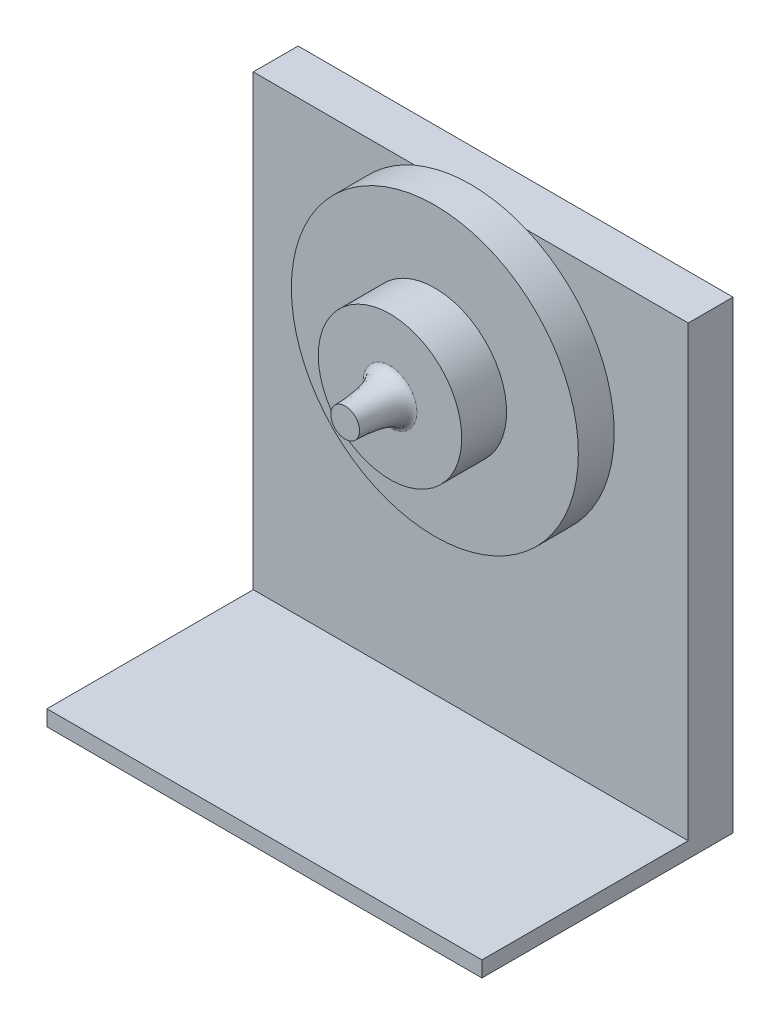
ISO-10303-21;
HEADER;
FILE_DESCRIPTION(('STEP AP214'),'2;1');
FILE_NAME('part.step','',(''),(''),'','','');
FILE_SCHEMA(('AUTOMOTIVE_DESIGN { 1 0 10303 214 1 1 1 1 }'));
ENDSEC;
DATA;
#1=APPLICATION_CONTEXT('core data for automotive mechanical design processes');
#2=APPLICATION_PROTOCOL_DEFINITION('international standard','automotive_design',2000,#1);
#3=PRODUCT_CONTEXT('',#1,'mechanical');
#4=PRODUCT('Part','Part','',(#3));
#5=PRODUCT_RELATED_PRODUCT_CATEGORY('part','',(#4));
#6=PRODUCT_DEFINITION_FORMATION('','',#4);
#7=PRODUCT_DEFINITION_CONTEXT('part definition',#1,'design');
#8=PRODUCT_DEFINITION('design','',#6,#7);
#9=PRODUCT_DEFINITION_SHAPE('','',#8);
#10=(LENGTH_UNIT() NAMED_UNIT(*) SI_UNIT(.MILLI.,.METRE.));
#11=(NAMED_UNIT(*) PLANE_ANGLE_UNIT() SI_UNIT($,.RADIAN.));
#12=(NAMED_UNIT(*) SI_UNIT($,.STERADIAN.) SOLID_ANGLE_UNIT());
#13=UNCERTAINTY_MEASURE_WITH_UNIT(LENGTH_MEASURE(1.E-05),#10,'distance_accuracy_value','');
#14=(GEOMETRIC_REPRESENTATION_CONTEXT(3) GLOBAL_UNCERTAINTY_ASSIGNED_CONTEXT((#13)) GLOBAL_UNIT_ASSIGNED_CONTEXT((#10,
#11,#12)) REPRESENTATION_CONTEXT('',''));
#15=CARTESIAN_POINT('',(0.,0.,0.));
#16=DIRECTION('',(0.,0.,1.));
#17=DIRECTION('',(1.,0.,0.));
#18=AXIS2_PLACEMENT_3D('',#15,#16,#17);
#19=CARTESIAN_POINT('',(-242.5,1.21076133831073E-13,-50.));
#20=DIRECTION('',(-1.,0.,0.));
#21=DIRECTION('',(0.,0.,1.));
#22=AXIS2_PLACEMENT_3D('',#19,#20,#21);
#23=PLANE('',#22);
#24=DIRECTION('',(0.,-1.,0.));
#25=VECTOR('',#24,1.);
#26=CARTESIAN_POINT('',(-242.5,1.21076133831073E-13,0.));
#27=LINE('',#26,#25);
#28=CARTESIAN_POINT('',(-242.5,500.,0.));
#29=VERTEX_POINT('',#28);
#30=CARTESIAN_POINT('',(-242.5,0.,0.));
#31=VERTEX_POINT('',#30);
#32=EDGE_CURVE('E77',#29,#31,#27,.T.);
#33=ORIENTED_EDGE('',*,*,#32,.F.);
#34=DIRECTION('',(0.,0.,1.));
#35=VECTOR('',#34,1.);
#36=CARTESIAN_POINT('',(-242.5,500.,-50.));
#37=LINE('',#36,#35);
#38=CARTESIAN_POINT('',(-242.5,500.,-50.));
#39=VERTEX_POINT('',#38);
#40=EDGE_CURVE('E47',#39,#29,#37,.T.);
#41=ORIENTED_EDGE('',*,*,#40,.F.);
#42=DIRECTION('',(0.,-1.,0.));
#43=VECTOR('',#42,1.);
#44=CARTESIAN_POINT('',(-242.5,1.21076133831073E-13,-50.));
#45=LINE('',#44,#43);
#46=CARTESIAN_POINT('',(-242.5,-17.5,-50.));
#47=VERTEX_POINT('',#46);
#48=EDGE_CURVE('E114',#39,#47,#45,.T.);
#49=ORIENTED_EDGE('',*,*,#48,.T.);
#50=DIRECTION('',(0.,0.,1.));
#51=VECTOR('',#50,1.);
#52=CARTESIAN_POINT('',(-242.5,-17.5,-50.));
#53=LINE('',#52,#51);
#54=CARTESIAN_POINT('',(-242.5,-17.5,230.));
#55=VERTEX_POINT('',#54);
#56=EDGE_CURVE('E133',#47,#55,#53,.T.);
#57=ORIENTED_EDGE('',*,*,#56,.T.);
#58=DIRECTION('',(0.,1.,0.));
#59=VECTOR('',#58,1.);
#60=CARTESIAN_POINT('',(-242.5,-17.5,230.));
#61=LINE('',#60,#59);
#62=CARTESIAN_POINT('',(-242.5,0.,230.));
#63=VERTEX_POINT('',#62);
#64=EDGE_CURVE('E106',#55,#63,#61,.T.);
#65=ORIENTED_EDGE('',*,*,#64,.T.);
#66=DIRECTION('',(0.,0.,1.));
#67=VECTOR('',#66,1.);
#68=CARTESIAN_POINT('',(-242.5,0.,-50.));
#69=LINE('',#68,#67);
#70=EDGE_CURVE('E97',#31,#63,#69,.T.);
#71=ORIENTED_EDGE('',*,*,#70,.F.);
#72=EDGE_LOOP('',(#33,#41,#49,#57,#65,#71));
#73=FACE_BOUND('',#72,.T.);
#74=ADVANCED_FACE('F39',(#73),#23,.T.);
#75=CARTESIAN_POINT('',(-242.5,500.,-50.));
#76=DIRECTION('',(0.,1.,0.));
#77=DIRECTION('',(-1.,0.,0.));
#78=AXIS2_PLACEMENT_3D('',#75,#76,#77);
#79=PLANE('',#78);
#80=DIRECTION('',(-1.,0.,0.));
#81=VECTOR('',#80,1.);
#82=CARTESIAN_POINT('',(-242.5,500.,0.));
#83=LINE('',#82,#81);
#84=CARTESIAN_POINT('',(242.5,500.,0.));
#85=VERTEX_POINT('',#84);
#86=CARTESIAN_POINT('',(62.2353597241954,500.,0.));
#87=VERTEX_POINT('',#86);
#88=EDGE_CURVE('E85',#85,#87,#83,.T.);
#89=ORIENTED_EDGE('',*,*,#88,.F.);
#90=DIRECTION('',(0.,0.,1.));
#91=VECTOR('',#90,1.);
#92=CARTESIAN_POINT('',(242.5,500.,-50.));
#93=LINE('',#92,#91);
#94=CARTESIAN_POINT('',(242.5,500.,-50.));
#95=VERTEX_POINT('',#94);
#96=EDGE_CURVE('E92',#95,#85,#93,.T.);
#97=ORIENTED_EDGE('',*,*,#96,.F.);
#98=DIRECTION('',(-1.,0.,0.));
#99=VECTOR('',#98,1.);
#100=CARTESIAN_POINT('',(-242.5,500.,-50.));
#101=LINE('',#100,#99);
#102=EDGE_CURVE('E90',#95,#39,#101,.T.);
#103=ORIENTED_EDGE('',*,*,#102,.T.);
#104=ORIENTED_EDGE('',*,*,#40,.T.);
#105=CARTESIAN_POINT('',(-62.2353597241954,500.,0.));
#106=VERTEX_POINT('',#105);
#107=EDGE_CURVE('E74',#106,#29,#83,.T.);
#108=ORIENTED_EDGE('',*,*,#107,.F.);
#109=EDGE_CURVE('E82',#87,#106,#83,.T.);
#110=ORIENTED_EDGE('',*,*,#109,.F.);
#111=EDGE_LOOP('',(#89,#97,#103,#104,#108,#110));
#112=FACE_BOUND('',#111,.T.);
#113=ADVANCED_FACE('F88',(#112),#79,.T.);
#114=CARTESIAN_POINT('',(242.5,1.21076133831073E-13,-50.));
#115=DIRECTION('',(1.,0.,0.));
#116=DIRECTION('',(0.,1.,0.));
#117=AXIS2_PLACEMENT_3D('',#114,#115,#116);
#118=PLANE('',#117);
#119=DIRECTION('',(0.,1.,0.));
#120=VECTOR('',#119,1.);
#121=CARTESIAN_POINT('',(242.5,1.21076133831073E-13,0.));
#122=LINE('',#121,#120);
#123=CARTESIAN_POINT('',(242.5,1.21076133831073E-13,0.));
#124=VERTEX_POINT('',#123);
#125=EDGE_CURVE('E83',#124,#85,#122,.T.);
#126=ORIENTED_EDGE('',*,*,#125,.F.);
#127=DIRECTION('',(0.,0.,-1.));
#128=VECTOR('',#127,1.);
#129=CARTESIAN_POINT('',(242.5,0.,-50.));
#130=LINE('',#129,#128);
#131=CARTESIAN_POINT('',(242.5,0.,230.));
#132=VERTEX_POINT('',#131);
#133=EDGE_CURVE('E130',#132,#124,#130,.T.);
#134=ORIENTED_EDGE('',*,*,#133,.F.);
#135=DIRECTION('',(0.,1.,0.));
#136=VECTOR('',#135,1.);
#137=CARTESIAN_POINT('',(242.5,-17.5,230.));
#138=LINE('',#137,#136);
#139=CARTESIAN_POINT('',(242.5,-17.5,230.));
#140=VERTEX_POINT('',#139);
#141=EDGE_CURVE('E100',#140,#132,#138,.T.);
#142=ORIENTED_EDGE('',*,*,#141,.F.);
#143=DIRECTION('',(0.,0.,-1.));
#144=VECTOR('',#143,1.);
#145=CARTESIAN_POINT('',(242.5,-17.5,-50.));
#146=LINE('',#145,#144);
#147=CARTESIAN_POINT('',(242.5,-17.5,-50.));
#148=VERTEX_POINT('',#147);
#149=EDGE_CURVE('E144',#140,#148,#146,.T.);
#150=ORIENTED_EDGE('',*,*,#149,.T.);
#151=DIRECTION('',(0.,1.,0.));
#152=VECTOR('',#151,1.);
#153=CARTESIAN_POINT('',(242.5,1.21076133831073E-13,-50.));
#154=LINE('',#153,#152);
#155=EDGE_CURVE('E120',#148,#95,#154,.T.);
#156=ORIENTED_EDGE('',*,*,#155,.T.);
#157=ORIENTED_EDGE('',*,*,#96,.T.);
#158=EDGE_LOOP('',(#126,#134,#142,#150,#156,#157));
#159=FACE_BOUND('',#158,.T.);
#160=ADVANCED_FACE('F225',(#159),#118,.T.);
#161=CARTESIAN_POINT('',(0.,0.,-50.));
#162=DIRECTION('',(0.,0.,-1.));
#163=DIRECTION('',(-1.,0.,0.));
#164=AXIS2_PLACEMENT_3D('',#161,#162,#163);
#165=PLANE('',#164);
#166=ORIENTED_EDGE('',*,*,#48,.F.);
#167=ORIENTED_EDGE('',*,*,#102,.F.);
#168=ORIENTED_EDGE('',*,*,#155,.F.);
#169=DIRECTION('',(-1.,0.,0.));
#170=VECTOR('',#169,1.);
#171=CARTESIAN_POINT('',(-242.5,-17.5,-50.));
#172=LINE('',#171,#170);
#173=EDGE_CURVE('E128',#148,#47,#172,.T.);
#174=ORIENTED_EDGE('',*,*,#173,.T.);
#175=EDGE_LOOP('',(#166,#167,#168,#174));
#176=FACE_BOUND('',#175,.T.);
#177=ADVANCED_FACE('F222',(#176),#165,.T.);
#178=CARTESIAN_POINT('',(0.,0.,0.));
#179=DIRECTION('',(0.,0.,-1.));
#180=DIRECTION('',(-1.,0.,0.));
#181=AXIS2_PLACEMENT_3D('',#178,#179,#180);
#182=PLANE('',#181);
#183=CARTESIAN_POINT('',(0.,352.6,0.));
#184=DIRECTION('',(0.,0.,-1.));
#185=DIRECTION('',(-1.,0.,0.));
#186=AXIS2_PLACEMENT_3D('',#183,#184,#185);
#187=CIRCLE('',#186,160.);
#188=EDGE_CURVE('E11',#106,#87,#187,.F.);
#189=ORIENTED_EDGE('',*,*,#188,.F.);
#190=ORIENTED_EDGE('',*,*,#107,.T.);
#191=ORIENTED_EDGE('',*,*,#32,.T.);
#192=DIRECTION('',(1.,0.,0.));
#193=VECTOR('',#192,1.);
#194=CARTESIAN_POINT('',(-242.5,1.21076133831073E-13,0.));
#195=LINE('',#194,#193);
#196=EDGE_CURVE('E99',#31,#124,#195,.T.);
#197=ORIENTED_EDGE('',*,*,#196,.T.);
#198=ORIENTED_EDGE('',*,*,#125,.T.);
#199=ORIENTED_EDGE('',*,*,#88,.T.);
#200=EDGE_LOOP('',(#189,#190,#191,#197,#198,#199));
#201=FACE_BOUND('',#200,.T.);
#202=ADVANCED_FACE('F75',(#201),#182,.F.);
#203=CARTESIAN_POINT('',(0.,0.,0.));
#204=DIRECTION('',(0.,1.,0.));
#205=DIRECTION('',(0.,0.,1.));
#206=AXIS2_PLACEMENT_3D('',#203,#204,#205);
#207=PLANE('',#206);
#208=ORIENTED_EDGE('',*,*,#196,.F.);
#209=ORIENTED_EDGE('',*,*,#70,.T.);
#210=DIRECTION('',(1.,0.,0.));
#211=VECTOR('',#210,1.);
#212=CARTESIAN_POINT('',(-242.5,0.,230.));
#213=LINE('',#212,#211);
#214=EDGE_CURVE('E134',#63,#132,#213,.T.);
#215=ORIENTED_EDGE('',*,*,#214,.T.);
#216=ORIENTED_EDGE('',*,*,#133,.T.);
#217=EDGE_LOOP('',(#208,#209,#215,#216));
#218=FACE_BOUND('',#217,.T.);
#219=ADVANCED_FACE('F215',(#218),#207,.T.);
#220=CARTESIAN_POINT('',(-242.5,-17.5,230.));
#221=DIRECTION('',(0.,0.,1.));
#222=DIRECTION('',(1.,0.,0.));
#223=AXIS2_PLACEMENT_3D('',#220,#221,#222);
#224=PLANE('',#223);
#225=ORIENTED_EDGE('',*,*,#214,.F.);
#226=ORIENTED_EDGE('',*,*,#64,.F.);
#227=DIRECTION('',(1.,0.,0.));
#228=VECTOR('',#227,1.);
#229=CARTESIAN_POINT('',(-242.5,-17.5,230.));
#230=LINE('',#229,#228);
#231=EDGE_CURVE('E147',#55,#140,#230,.T.);
#232=ORIENTED_EDGE('',*,*,#231,.T.);
#233=ORIENTED_EDGE('',*,*,#141,.T.);
#234=EDGE_LOOP('',(#225,#226,#232,#233));
#235=FACE_BOUND('',#234,.T.);
#236=ADVANCED_FACE('F213',(#235),#224,.T.);
#237=CARTESIAN_POINT('',(0.,-17.5,0.));
#238=DIRECTION('',(0.,1.,0.));
#239=DIRECTION('',(0.,0.,1.));
#240=AXIS2_PLACEMENT_3D('',#237,#238,#239);
#241=PLANE('',#240);
#242=ORIENTED_EDGE('',*,*,#56,.F.);
#243=ORIENTED_EDGE('',*,*,#173,.F.);
#244=ORIENTED_EDGE('',*,*,#149,.F.);
#245=ORIENTED_EDGE('',*,*,#231,.F.);
#246=EDGE_LOOP('',(#242,#243,#244,#245));
#247=FACE_BOUND('',#246,.T.);
#248=ADVANCED_FACE('F209',(#247),#241,.F.);
#249=CARTESIAN_POINT('',(0.,352.6,0.));
#250=DIRECTION('',(0.,0.,1.));
#251=DIRECTION('',(1.,0.,0.));
#252=AXIS2_PLACEMENT_3D('',#249,#250,#251);
#253=PLANE('',#252);
#254=ORIENTED_EDGE('',*,*,#109,.T.);
#255=CARTESIAN_POINT('',(0.,352.6,0.));
#256=DIRECTION('',(0.,0.,-1.));
#257=DIRECTION('',(-1.,0.,0.));
#258=AXIS2_PLACEMENT_3D('',#255,#256,#257);
#259=CIRCLE('',#258,160.);
#260=EDGE_CURVE('E140',#106,#87,#259,.T.);
#261=ORIENTED_EDGE('',*,*,#260,.T.);
#262=EDGE_LOOP('',(#254,#261));
#263=FACE_BOUND('',#262,.T.);
#264=ADVANCED_FACE('F205',(#263),#253,.F.);
#265=CARTESIAN_POINT('',(0.,352.6,0.));
#266=DIRECTION('',(0.,0.,-1.));
#267=DIRECTION('',(-1.,0.,0.));
#268=AXIS2_PLACEMENT_3D('',#265,#266,#267);
#269=CYLINDRICAL_SURFACE('',#268,160.);
#270=ORIENTED_EDGE('',*,*,#260,.F.);
#271=ORIENTED_EDGE('',*,*,#188,.T.);
#272=EDGE_LOOP('',(#270,#271));
#273=FACE_BOUND('',#272,.T.);
#274=CARTESIAN_POINT('',(0.,352.6,40.));
#275=DIRECTION('',(0.,0.,-1.));
#276=DIRECTION('',(-1.,0.,0.));
#277=AXIS2_PLACEMENT_3D('',#274,#275,#276);
#278=CIRCLE('',#277,160.);
#279=CARTESIAN_POINT('',(-160.,352.6,40.));
#280=VERTEX_POINT('',#279);
#281=EDGE_CURVE('E157',#280,#280,#278,.T.);
#282=ORIENTED_EDGE('',*,*,#281,.T.);
#283=EDGE_LOOP('',(#282));
#284=FACE_BOUND('',#283,.T.);
#285=ADVANCED_FACE('F201',(#273,#284),#269,.T.);
#286=CARTESIAN_POINT('',(160.,352.6,40.));
#287=DIRECTION('',(0.,0.,-1.));
#288=DIRECTION('',(-1.,0.,0.));
#289=AXIS2_PLACEMENT_3D('',#286,#287,#288);
#290=PLANE('',#289);
#291=ORIENTED_EDGE('',*,*,#281,.F.);
#292=EDGE_LOOP('',(#291));
#293=FACE_BOUND('',#292,.T.);
#294=CARTESIAN_POINT('',(0.,352.6,40.));
#295=DIRECTION('',(0.,0.,-1.));
#296=DIRECTION('',(-1.,0.,0.));
#297=AXIS2_PLACEMENT_3D('',#294,#295,#296);
#298=CIRCLE('',#297,80.);
#299=CARTESIAN_POINT('',(-80.,352.6,40.));
#300=VERTEX_POINT('',#299);
#301=EDGE_CURVE('E161',#300,#300,#298,.T.);
#302=ORIENTED_EDGE('',*,*,#301,.T.);
#303=EDGE_LOOP('',(#302));
#304=FACE_BOUND('',#303,.T.);
#305=ADVANCED_FACE('F197',(#293,#304),#290,.F.);
#306=CARTESIAN_POINT('',(0.,352.6,0.));
#307=DIRECTION('',(0.,0.,-1.));
#308=DIRECTION('',(-1.,0.,0.));
#309=AXIS2_PLACEMENT_3D('',#306,#307,#308);
#310=CYLINDRICAL_SURFACE('',#309,80.);
#311=ORIENTED_EDGE('',*,*,#301,.F.);
#312=EDGE_LOOP('',(#311));
#313=FACE_BOUND('',#312,.T.);
#314=CARTESIAN_POINT('',(0.,352.6,90.));
#315=DIRECTION('',(0.,0.,-1.));
#316=DIRECTION('',(-1.,0.,0.));
#317=AXIS2_PLACEMENT_3D('',#314,#315,#316);
#318=CIRCLE('',#317,80.);
#319=CARTESIAN_POINT('',(-80.,352.6,90.));
#320=VERTEX_POINT('',#319);
#321=EDGE_CURVE('E165',#320,#320,#318,.T.);
#322=ORIENTED_EDGE('',*,*,#321,.T.);
#323=EDGE_LOOP('',(#322));
#324=FACE_BOUND('',#323,.T.);
#325=ADVANCED_FACE('F193',(#313,#324),#310,.T.);
#326=CARTESIAN_POINT('',(80.,352.6,90.));
#327=DIRECTION('',(0.,0.,-1.));
#328=DIRECTION('',(-1.,0.,0.));
#329=AXIS2_PLACEMENT_3D('',#326,#327,#328);
#330=PLANE('',#329);
#331=ORIENTED_EDGE('',*,*,#321,.F.);
#332=EDGE_LOOP('',(#331));
#333=FACE_BOUND('',#332,.T.);
#334=CARTESIAN_POINT('',(0.,352.6,90.));
#335=DIRECTION('',(0.,0.,-1.));
#336=DIRECTION('',(-1.,0.,0.));
#337=AXIS2_PLACEMENT_3D('',#334,#335,#336);
#338=CIRCLE('',#337,30.);
#339=CARTESIAN_POINT('',(-30.,352.6,90.));
#340=VERTEX_POINT('',#339);
#341=EDGE_CURVE('E169',#340,#340,#338,.T.);
#342=ORIENTED_EDGE('',*,*,#341,.T.);
#343=EDGE_LOOP('',(#342));
#344=FACE_BOUND('',#343,.T.);
#345=ADVANCED_FACE('F189',(#333,#344),#330,.F.);
#346=CARTESIAN_POINT('',(16.,352.6,140.));
#347=CARTESIAN_POINT('',(16.,352.6,123.873269223396));
#348=CARTESIAN_POINT('',(19.3053922170691,352.6,92.0133073083895));
#349=CARTESIAN_POINT('',(30.,352.6,90.));
#350=B_SPLINE_CURVE_WITH_KNOTS('',3,(#346,#347,#348,#349),.UNSPECIFIED.,.F.,.F.,(4,4),(0.,1.),.UNSPECIFIED.);
#351=CARTESIAN_POINT('',(0.,352.6,0.));
#352=DIRECTION('',(0.,0.,-1.));
#353=AXIS1_PLACEMENT('',#351,#352);
#354=SURFACE_OF_REVOLUTION('',#350,#353);
#355=ORIENTED_EDGE('',*,*,#341,.F.);
#356=EDGE_LOOP('',(#355));
#357=FACE_BOUND('',#356,.T.);
#358=CARTESIAN_POINT('',(0.,352.6,140.));
#359=DIRECTION('',(0.,0.,-1.));
#360=DIRECTION('',(-1.,0.,0.));
#361=AXIS2_PLACEMENT_3D('',#358,#359,#360);
#362=CIRCLE('',#361,16.);
#363=CARTESIAN_POINT('',(-16.,352.6,140.));
#364=VERTEX_POINT('',#363);
#365=EDGE_CURVE('E173',#364,#364,#362,.T.);
#366=ORIENTED_EDGE('',*,*,#365,.T.);
#367=EDGE_LOOP('',(#366));
#368=FACE_BOUND('',#367,.T.);
#369=ADVANCED_FACE('F184',(#357,#368),#354,.T.);
#370=CARTESIAN_POINT('',(15.6910410256754,352.6,140.));
#371=DIRECTION('',(0.,0.,-1.));
#372=DIRECTION('',(-1.,0.,0.));
#373=AXIS2_PLACEMENT_3D('',#370,#371,#372);
#374=PLANE('',#373);
#375=ORIENTED_EDGE('',*,*,#365,.F.);
#376=EDGE_LOOP('',(#375));
#377=FACE_BOUND('',#376,.T.);
#378=ADVANCED_FACE('F188',(#377),#374,.F.);
#379=CLOSED_SHELL('',(#74,#113,#160,#177,#202,#219,#236,#248,#264,#285,#305,#325,#345,#369,#378));
#380=MANIFOLD_SOLID_BREP('B2',#379);
#381=ADVANCED_BREP_SHAPE_REPRESENTATION('',(#18,#380),#14);
#382=SHAPE_DEFINITION_REPRESENTATION(#9,#381);
ENDSEC;
END-ISO-10303-21;
